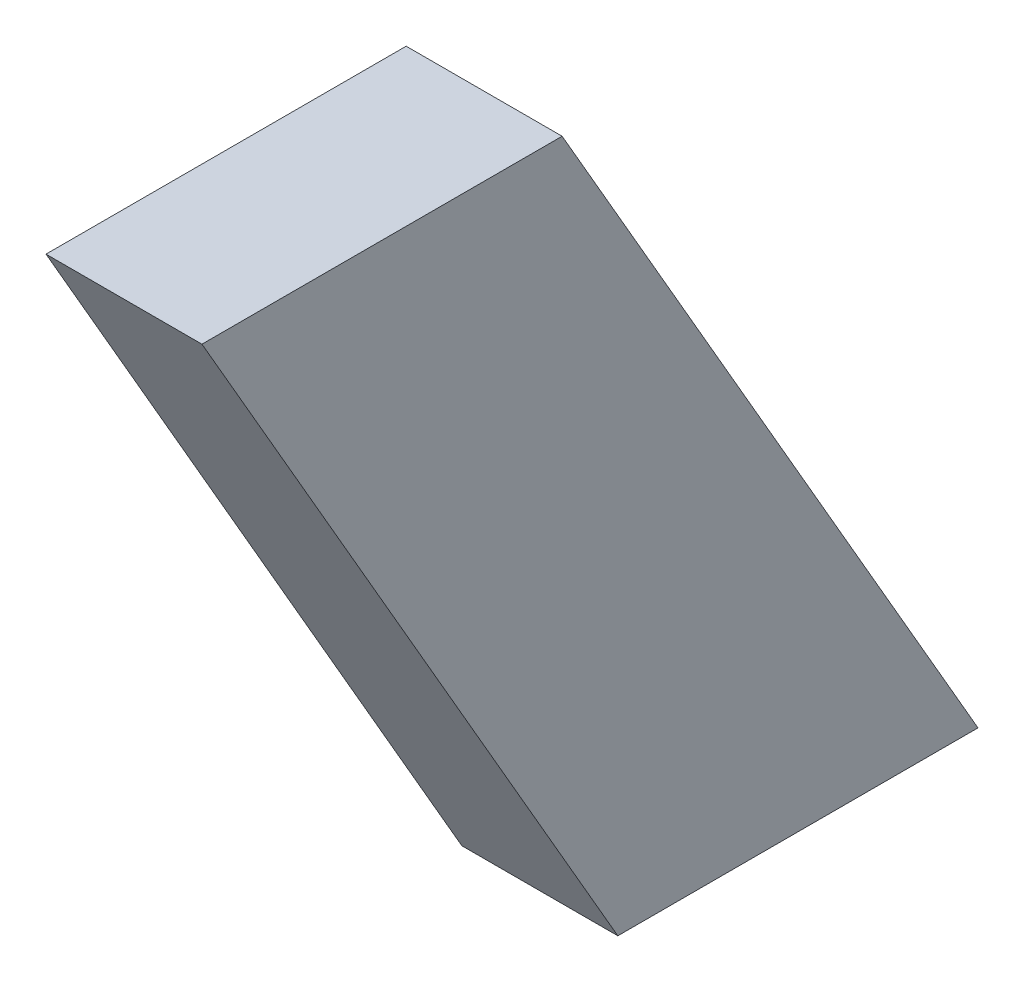
ISO-10303-21;
HEADER;
FILE_DESCRIPTION(('STEP AP214'),'2;1');
FILE_NAME('part.step','',(''),(''),'','','');
FILE_SCHEMA(('AUTOMOTIVE_DESIGN { 1 0 10303 214 1 1 1 1 }'));
ENDSEC;
DATA;
#1=APPLICATION_CONTEXT('core data for automotive mechanical design processes');
#2=APPLICATION_PROTOCOL_DEFINITION('international standard','automotive_design',2000,#1);
#3=PRODUCT_CONTEXT('',#1,'mechanical');
#4=PRODUCT('Part','Part','',(#3));
#5=PRODUCT_RELATED_PRODUCT_CATEGORY('part','',(#4));
#6=PRODUCT_DEFINITION_FORMATION('','',#4);
#7=PRODUCT_DEFINITION_CONTEXT('part definition',#1,'design');
#8=PRODUCT_DEFINITION('design','',#6,#7);
#9=PRODUCT_DEFINITION_SHAPE('','',#8);
#10=(LENGTH_UNIT() NAMED_UNIT(*) SI_UNIT(.MILLI.,.METRE.));
#11=(NAMED_UNIT(*) PLANE_ANGLE_UNIT() SI_UNIT($,.RADIAN.));
#12=(NAMED_UNIT(*) SI_UNIT($,.STERADIAN.) SOLID_ANGLE_UNIT());
#13=UNCERTAINTY_MEASURE_WITH_UNIT(LENGTH_MEASURE(1.E-05),#10,'distance_accuracy_value','');
#14=(GEOMETRIC_REPRESENTATION_CONTEXT(3) GLOBAL_UNCERTAINTY_ASSIGNED_CONTEXT((#13)) GLOBAL_UNIT_ASSIGNED_CONTEXT((#10,
#11,#12)) REPRESENTATION_CONTEXT('',''));
#15=CARTESIAN_POINT('',(0.,0.,0.));
#16=DIRECTION('',(0.,0.,1.));
#17=DIRECTION('',(1.,0.,0.));
#18=AXIS2_PLACEMENT_3D('',#15,#16,#17);
#19=CARTESIAN_POINT('',(19.05,-87.9881810244987,-50.8000000000004));
#20=DIRECTION('',(0.,0.500000000000004,-0.866025403784436));
#21=DIRECTION('',(0.,0.866025403784436,0.500000000000004));
#22=AXIS2_PLACEMENT_3D('',#19,#20,#21);
#23=PLANE('',#22);
#24=DIRECTION('',(0.,-0.866025403784436,-0.500000000000004));
#25=VECTOR('',#24,1.);
#26=CARTESIAN_POINT('',(0.,-87.9881810244987,-50.8000000000004));
#27=LINE('',#26,#25);
#28=CARTESIAN_POINT('',(0.,0.,0.));
#29=VERTEX_POINT('',#28);
#30=CARTESIAN_POINT('',(0.,-87.9881810244987,-50.8000000000004));
#31=VERTEX_POINT('',#30);
#32=EDGE_CURVE('E96',#29,#31,#27,.T.);
#33=ORIENTED_EDGE('',*,*,#32,.T.);
#34=DIRECTION('',(-1.,0.,0.));
#35=VECTOR('',#34,1.);
#36=CARTESIAN_POINT('',(19.05,-87.9881810244987,-50.8000000000004));
#37=LINE('',#36,#35);
#38=CARTESIAN_POINT('',(19.05,-87.9881810244987,-50.8000000000004));
#39=VERTEX_POINT('',#38);
#40=EDGE_CURVE('E11',#39,#31,#37,.T.);
#41=ORIENTED_EDGE('',*,*,#40,.F.);
#42=DIRECTION('',(0.,-0.866025403784436,-0.500000000000004));
#43=VECTOR('',#42,1.);
#44=CARTESIAN_POINT('',(19.05,-87.9881810244987,-50.8000000000004));
#45=LINE('',#44,#43);
#46=CARTESIAN_POINT('',(19.05,0.,0.));
#47=VERTEX_POINT('',#46);
#48=EDGE_CURVE('E84',#47,#39,#45,.T.);
#49=ORIENTED_EDGE('',*,*,#48,.F.);
#50=DIRECTION('',(-1.,0.,0.));
#51=VECTOR('',#50,1.);
#52=CARTESIAN_POINT('',(19.05,0.,0.));
#53=LINE('',#52,#51);
#54=EDGE_CURVE('E92',#47,#29,#53,.T.);
#55=ORIENTED_EDGE('',*,*,#54,.T.);
#56=EDGE_LOOP('',(#33,#41,#49,#55));
#57=FACE_BOUND('',#56,.T.);
#58=ADVANCED_FACE('F33',(#57),#23,.F.);
#59=CARTESIAN_POINT('',(19.05,-87.9881810244987,-94.79409051225));
#60=DIRECTION('',(0.,1.,0.));
#61=DIRECTION('',(0.,0.,1.));
#62=AXIS2_PLACEMENT_3D('',#59,#60,#61);
#63=PLANE('',#62);
#64=DIRECTION('',(0.,0.,-1.));
#65=VECTOR('',#64,1.);
#66=CARTESIAN_POINT('',(0.,-87.9881810244987,-94.79409051225));
#67=LINE('',#66,#65);
#68=CARTESIAN_POINT('',(0.,-87.9881810244987,-94.79409051225));
#69=VERTEX_POINT('',#68);
#70=EDGE_CURVE('E88',#31,#69,#67,.T.);
#71=ORIENTED_EDGE('',*,*,#70,.T.);
#72=DIRECTION('',(-1.,0.,0.));
#73=VECTOR('',#72,1.);
#74=CARTESIAN_POINT('',(19.05,-87.9881810244987,-94.79409051225));
#75=LINE('',#74,#73);
#76=CARTESIAN_POINT('',(19.05,-87.9881810244987,-94.79409051225));
#77=VERTEX_POINT('',#76);
#78=EDGE_CURVE('E41',#77,#69,#75,.T.);
#79=ORIENTED_EDGE('',*,*,#78,.F.);
#80=DIRECTION('',(0.,0.,-1.));
#81=VECTOR('',#80,1.);
#82=CARTESIAN_POINT('',(19.05,-87.9881810244987,-94.79409051225));
#83=LINE('',#82,#81);
#84=EDGE_CURVE('E79',#39,#77,#83,.T.);
#85=ORIENTED_EDGE('',*,*,#84,.F.);
#86=ORIENTED_EDGE('',*,*,#40,.T.);
#87=EDGE_LOOP('',(#71,#79,#85,#86));
#88=FACE_BOUND('',#87,.T.);
#89=ADVANCED_FACE('F87',(#88),#63,.F.);
#90=CARTESIAN_POINT('',(19.05,0.,-43.9940905122496));
#91=DIRECTION('',(0.,-0.500000000000004,0.866025403784436));
#92=DIRECTION('',(0.,-0.866025403784436,-0.500000000000004));
#93=AXIS2_PLACEMENT_3D('',#90,#91,#92);
#94=PLANE('',#93);
#95=DIRECTION('',(0.,0.866025403784436,0.500000000000004));
#96=VECTOR('',#95,1.);
#97=CARTESIAN_POINT('',(0.,0.,-43.9940905122496));
#98=LINE('',#97,#96);
#99=CARTESIAN_POINT('',(0.,0.,-43.9940905122496));
#100=VERTEX_POINT('',#99);
#101=EDGE_CURVE('E66',#69,#100,#98,.T.);
#102=ORIENTED_EDGE('',*,*,#101,.T.);
#103=DIRECTION('',(-1.,0.,0.));
#104=VECTOR('',#103,1.);
#105=CARTESIAN_POINT('',(19.05,0.,-43.9940905122496));
#106=LINE('',#105,#104);
#107=CARTESIAN_POINT('',(19.05,0.,-43.9940905122496));
#108=VERTEX_POINT('',#107);
#109=EDGE_CURVE('E89',#108,#100,#106,.T.);
#110=ORIENTED_EDGE('',*,*,#109,.F.);
#111=DIRECTION('',(0.,0.866025403784436,0.500000000000004));
#112=VECTOR('',#111,1.);
#113=CARTESIAN_POINT('',(19.05,0.,-43.9940905122496));
#114=LINE('',#113,#112);
#115=EDGE_CURVE('E82',#77,#108,#114,.T.);
#116=ORIENTED_EDGE('',*,*,#115,.F.);
#117=ORIENTED_EDGE('',*,*,#78,.T.);
#118=EDGE_LOOP('',(#102,#110,#116,#117));
#119=FACE_BOUND('',#118,.T.);
#120=ADVANCED_FACE('F90',(#119),#94,.F.);
#121=CARTESIAN_POINT('',(19.05,0.,0.));
#122=DIRECTION('',(0.,-1.,0.));
#123=DIRECTION('',(0.,0.,-1.));
#124=AXIS2_PLACEMENT_3D('',#121,#122,#123);
#125=PLANE('',#124);
#126=DIRECTION('',(0.,0.,1.));
#127=VECTOR('',#126,1.);
#128=CARTESIAN_POINT('',(0.,0.,0.));
#129=LINE('',#128,#127);
#130=EDGE_CURVE('E72',#100,#29,#129,.T.);
#131=ORIENTED_EDGE('',*,*,#130,.T.);
#132=ORIENTED_EDGE('',*,*,#54,.F.);
#133=DIRECTION('',(0.,0.,1.));
#134=VECTOR('',#133,1.);
#135=CARTESIAN_POINT('',(19.05,0.,0.));
#136=LINE('',#135,#134);
#137=EDGE_CURVE('E49',#108,#47,#136,.T.);
#138=ORIENTED_EDGE('',*,*,#137,.F.);
#139=ORIENTED_EDGE('',*,*,#109,.T.);
#140=EDGE_LOOP('',(#131,#132,#138,#139));
#141=FACE_BOUND('',#140,.T.);
#142=ADVANCED_FACE('F103',(#141),#125,.F.);
#143=CARTESIAN_POINT('',(19.05,0.,0.));
#144=DIRECTION('',(-1.,0.,0.));
#145=DIRECTION('',(0.,0.,1.));
#146=AXIS2_PLACEMENT_3D('',#143,#144,#145);
#147=PLANE('',#146);
#148=ORIENTED_EDGE('',*,*,#48,.T.);
#149=ORIENTED_EDGE('',*,*,#84,.T.);
#150=ORIENTED_EDGE('',*,*,#115,.T.);
#151=ORIENTED_EDGE('',*,*,#137,.T.);
#152=EDGE_LOOP('',(#148,#149,#150,#151));
#153=FACE_BOUND('',#152,.T.);
#154=ADVANCED_FACE('F80',(#153),#147,.F.);
#155=CARTESIAN_POINT('',(0.,0.,0.));
#156=DIRECTION('',(-1.,0.,0.));
#157=DIRECTION('',(0.,0.,1.));
#158=AXIS2_PLACEMENT_3D('',#155,#156,#157);
#159=PLANE('',#158);
#160=ORIENTED_EDGE('',*,*,#32,.F.);
#161=ORIENTED_EDGE('',*,*,#130,.F.);
#162=ORIENTED_EDGE('',*,*,#101,.F.);
#163=ORIENTED_EDGE('',*,*,#70,.F.);
#164=EDGE_LOOP('',(#160,#161,#162,#163));
#165=FACE_BOUND('',#164,.T.);
#166=ADVANCED_FACE('F106',(#165),#159,.T.);
#167=CLOSED_SHELL('',(#58,#89,#120,#142,#154,#166));
#168=MANIFOLD_SOLID_BREP('B2',#167);
#169=ADVANCED_BREP_SHAPE_REPRESENTATION('',(#18,#168),#14);
#170=SHAPE_DEFINITION_REPRESENTATION(#9,#169);
ENDSEC;
END-ISO-10303-21;
